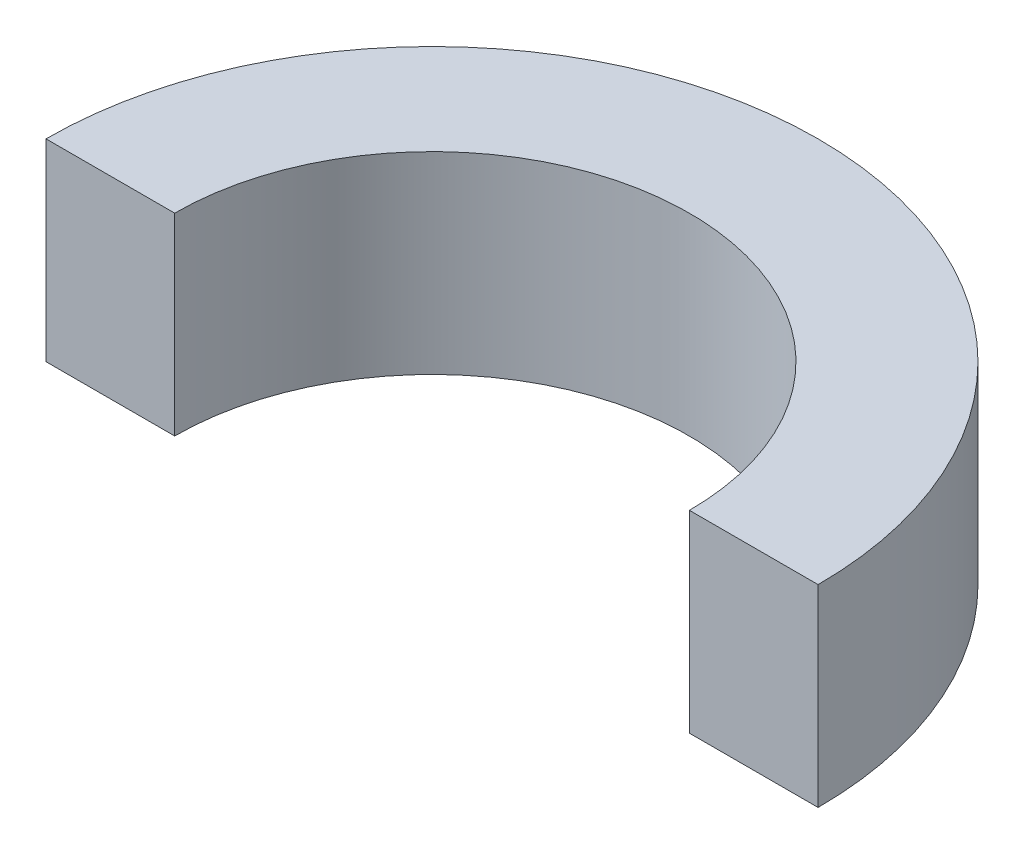
ISO-10303-21;
HEADER;
FILE_DESCRIPTION(('STEP AP214'),'2;1');
FILE_NAME('part.step','',(''),(''),'','','');
FILE_SCHEMA(('AUTOMOTIVE_DESIGN { 1 0 10303 214 1 1 1 1 }'));
ENDSEC;
DATA;
#1=APPLICATION_CONTEXT('core data for automotive mechanical design processes');
#2=APPLICATION_PROTOCOL_DEFINITION('international standard','automotive_design',2000,#1);
#3=PRODUCT_CONTEXT('',#1,'mechanical');
#4=PRODUCT('Part','Part','',(#3));
#5=PRODUCT_RELATED_PRODUCT_CATEGORY('part','',(#4));
#6=PRODUCT_DEFINITION_FORMATION('','',#4);
#7=PRODUCT_DEFINITION_CONTEXT('part definition',#1,'design');
#8=PRODUCT_DEFINITION('design','',#6,#7);
#9=PRODUCT_DEFINITION_SHAPE('','',#8);
#10=(LENGTH_UNIT() NAMED_UNIT(*) SI_UNIT(.MILLI.,.METRE.));
#11=(NAMED_UNIT(*) PLANE_ANGLE_UNIT() SI_UNIT($,.RADIAN.));
#12=(NAMED_UNIT(*) SI_UNIT($,.STERADIAN.) SOLID_ANGLE_UNIT());
#13=UNCERTAINTY_MEASURE_WITH_UNIT(LENGTH_MEASURE(1.E-05),#10,'distance_accuracy_value','');
#14=(GEOMETRIC_REPRESENTATION_CONTEXT(3) GLOBAL_UNCERTAINTY_ASSIGNED_CONTEXT((#13)) GLOBAL_UNIT_ASSIGNED_CONTEXT((#10,
#11,#12)) REPRESENTATION_CONTEXT('',''));
#15=CARTESIAN_POINT('',(0.,0.,0.));
#16=DIRECTION('',(0.,0.,1.));
#17=DIRECTION('',(1.,0.,0.));
#18=AXIS2_PLACEMENT_3D('',#15,#16,#17);
#19=CARTESIAN_POINT('',(0.,15.,0.));
#20=DIRECTION('',(0.,-1.,0.));
#21=DIRECTION('',(0.,0.,-1.));
#22=AXIS2_PLACEMENT_3D('',#19,#20,#21);
#23=CYLINDRICAL_SURFACE('',#22,30.);
#24=CARTESIAN_POINT('',(0.,0.,0.));
#25=DIRECTION('',(0.,1.,0.));
#26=DIRECTION('',(0.,0.,-1.));
#27=AXIS2_PLACEMENT_3D('',#24,#25,#26);
#28=CIRCLE('',#27,30.);
#29=CARTESIAN_POINT('',(30.,0.,0.));
#30=VERTEX_POINT('',#29);
#31=CARTESIAN_POINT('',(-30.,0.,0.));
#32=VERTEX_POINT('',#31);
#33=EDGE_CURVE('E113',#30,#32,#28,.T.);
#34=ORIENTED_EDGE('',*,*,#33,.T.);
#35=DIRECTION('',(0.,-1.,0.));
#36=VECTOR('',#35,1.);
#37=CARTESIAN_POINT('',(-30.,15.,0.));
#38=LINE('',#37,#36);
#39=CARTESIAN_POINT('',(-30.,15.,0.));
#40=VERTEX_POINT('',#39);
#41=EDGE_CURVE('E11',#40,#32,#38,.T.);
#42=ORIENTED_EDGE('',*,*,#41,.F.);
#43=CARTESIAN_POINT('',(0.,15.,0.));
#44=DIRECTION('',(0.,1.,0.));
#45=DIRECTION('',(0.,0.,-1.));
#46=AXIS2_PLACEMENT_3D('',#43,#44,#45);
#47=CIRCLE('',#46,30.);
#48=CARTESIAN_POINT('',(30.,15.,0.));
#49=VERTEX_POINT('',#48);
#50=EDGE_CURVE('E97',#49,#40,#47,.T.);
#51=ORIENTED_EDGE('',*,*,#50,.F.);
#52=DIRECTION('',(0.,-1.,0.));
#53=VECTOR('',#52,1.);
#54=CARTESIAN_POINT('',(30.,15.,0.));
#55=LINE('',#54,#53);
#56=EDGE_CURVE('E109',#49,#30,#55,.T.);
#57=ORIENTED_EDGE('',*,*,#56,.T.);
#58=EDGE_LOOP('',(#34,#42,#51,#57));
#59=FACE_BOUND('',#58,.T.);
#60=ADVANCED_FACE('F45',(#59),#23,.T.);
#61=CARTESIAN_POINT('',(-30.,15.,0.));
#62=DIRECTION('',(0.,0.,-1.));
#63=DIRECTION('',(-1.,0.,0.));
#64=AXIS2_PLACEMENT_3D('',#61,#62,#63);
#65=PLANE('',#64);
#66=DIRECTION('',(1.,0.,0.));
#67=VECTOR('',#66,1.);
#68=CARTESIAN_POINT('',(-30.,0.,0.));
#69=LINE('',#68,#67);
#70=CARTESIAN_POINT('',(-20.,0.,0.));
#71=VERTEX_POINT('',#70);
#72=EDGE_CURVE('E102',#32,#71,#69,.T.);
#73=ORIENTED_EDGE('',*,*,#72,.T.);
#74=DIRECTION('',(0.,-1.,0.));
#75=VECTOR('',#74,1.);
#76=CARTESIAN_POINT('',(-20.,15.,0.));
#77=LINE('',#76,#75);
#78=CARTESIAN_POINT('',(-20.,15.,0.));
#79=VERTEX_POINT('',#78);
#80=EDGE_CURVE('E54',#79,#71,#77,.T.);
#81=ORIENTED_EDGE('',*,*,#80,.F.);
#82=DIRECTION('',(1.,0.,0.));
#83=VECTOR('',#82,1.);
#84=CARTESIAN_POINT('',(-30.,15.,0.));
#85=LINE('',#84,#83);
#86=EDGE_CURVE('E92',#40,#79,#85,.T.);
#87=ORIENTED_EDGE('',*,*,#86,.F.);
#88=ORIENTED_EDGE('',*,*,#41,.T.);
#89=EDGE_LOOP('',(#73,#81,#87,#88));
#90=FACE_BOUND('',#89,.T.);
#91=ADVANCED_FACE('F101',(#90),#65,.F.);
#92=CARTESIAN_POINT('',(0.,15.,0.));
#93=DIRECTION('',(0.,-1.,0.));
#94=DIRECTION('',(0.,0.,-1.));
#95=AXIS2_PLACEMENT_3D('',#92,#93,#94);
#96=CYLINDRICAL_SURFACE('',#95,20.);
#97=CARTESIAN_POINT('',(0.,0.,0.));
#98=DIRECTION('',(0.,-1.,0.));
#99=DIRECTION('',(0.,0.,-1.));
#100=AXIS2_PLACEMENT_3D('',#97,#98,#99);
#101=CIRCLE('',#100,20.);
#102=CARTESIAN_POINT('',(20.,0.,0.));
#103=VERTEX_POINT('',#102);
#104=EDGE_CURVE('E79',#71,#103,#101,.T.);
#105=ORIENTED_EDGE('',*,*,#104,.T.);
#106=DIRECTION('',(0.,-1.,0.));
#107=VECTOR('',#106,1.);
#108=CARTESIAN_POINT('',(20.,15.,0.));
#109=LINE('',#108,#107);
#110=CARTESIAN_POINT('',(20.,15.,0.));
#111=VERTEX_POINT('',#110);
#112=EDGE_CURVE('E104',#111,#103,#109,.T.);
#113=ORIENTED_EDGE('',*,*,#112,.F.);
#114=CARTESIAN_POINT('',(0.,15.,0.));
#115=DIRECTION('',(0.,-1.,0.));
#116=DIRECTION('',(0.,0.,-1.));
#117=AXIS2_PLACEMENT_3D('',#114,#115,#116);
#118=CIRCLE('',#117,20.);
#119=EDGE_CURVE('E95',#79,#111,#118,.T.);
#120=ORIENTED_EDGE('',*,*,#119,.F.);
#121=ORIENTED_EDGE('',*,*,#80,.T.);
#122=EDGE_LOOP('',(#105,#113,#120,#121));
#123=FACE_BOUND('',#122,.T.);
#124=ADVANCED_FACE('F105',(#123),#96,.F.);
#125=CARTESIAN_POINT('',(20.,15.,0.));
#126=DIRECTION('',(0.,0.,-1.));
#127=DIRECTION('',(-1.,0.,0.));
#128=AXIS2_PLACEMENT_3D('',#125,#126,#127);
#129=PLANE('',#128);
#130=DIRECTION('',(1.,0.,0.));
#131=VECTOR('',#130,1.);
#132=CARTESIAN_POINT('',(20.,0.,0.));
#133=LINE('',#132,#131);
#134=EDGE_CURVE('E85',#103,#30,#133,.T.);
#135=ORIENTED_EDGE('',*,*,#134,.T.);
#136=ORIENTED_EDGE('',*,*,#56,.F.);
#137=DIRECTION('',(1.,0.,0.));
#138=VECTOR('',#137,1.);
#139=CARTESIAN_POINT('',(20.,15.,0.));
#140=LINE('',#139,#138);
#141=EDGE_CURVE('E62',#111,#49,#140,.T.);
#142=ORIENTED_EDGE('',*,*,#141,.F.);
#143=ORIENTED_EDGE('',*,*,#112,.T.);
#144=EDGE_LOOP('',(#135,#136,#142,#143));
#145=FACE_BOUND('',#144,.T.);
#146=ADVANCED_FACE('F126',(#145),#129,.F.);
#147=CARTESIAN_POINT('',(0.,15.,0.));
#148=DIRECTION('',(0.,-1.,0.));
#149=DIRECTION('',(0.,0.,-1.));
#150=AXIS2_PLACEMENT_3D('',#147,#148,#149);
#151=PLANE('',#150);
#152=ORIENTED_EDGE('',*,*,#50,.T.);
#153=ORIENTED_EDGE('',*,*,#86,.T.);
#154=ORIENTED_EDGE('',*,*,#119,.T.);
#155=ORIENTED_EDGE('',*,*,#141,.T.);
#156=EDGE_LOOP('',(#152,#153,#154,#155));
#157=FACE_BOUND('',#156,.T.);
#158=ADVANCED_FACE('F93',(#157),#151,.F.);
#159=CARTESIAN_POINT('',(0.,0.,0.));
#160=DIRECTION('',(0.,-1.,0.));
#161=DIRECTION('',(0.,0.,-1.));
#162=AXIS2_PLACEMENT_3D('',#159,#160,#161);
#163=PLANE('',#162);
#164=ORIENTED_EDGE('',*,*,#33,.F.);
#165=ORIENTED_EDGE('',*,*,#134,.F.);
#166=ORIENTED_EDGE('',*,*,#104,.F.);
#167=ORIENTED_EDGE('',*,*,#72,.F.);
#168=EDGE_LOOP('',(#164,#165,#166,#167));
#169=FACE_BOUND('',#168,.T.);
#170=ADVANCED_FACE('F129',(#169),#163,.T.);
#171=CLOSED_SHELL('',(#60,#91,#124,#146,#158,#170));
#172=MANIFOLD_SOLID_BREP('B2',#171);
#173=ADVANCED_BREP_SHAPE_REPRESENTATION('',(#18,#172),#14);
#174=SHAPE_DEFINITION_REPRESENTATION(#9,#173);
ENDSEC;
END-ISO-10303-21;
